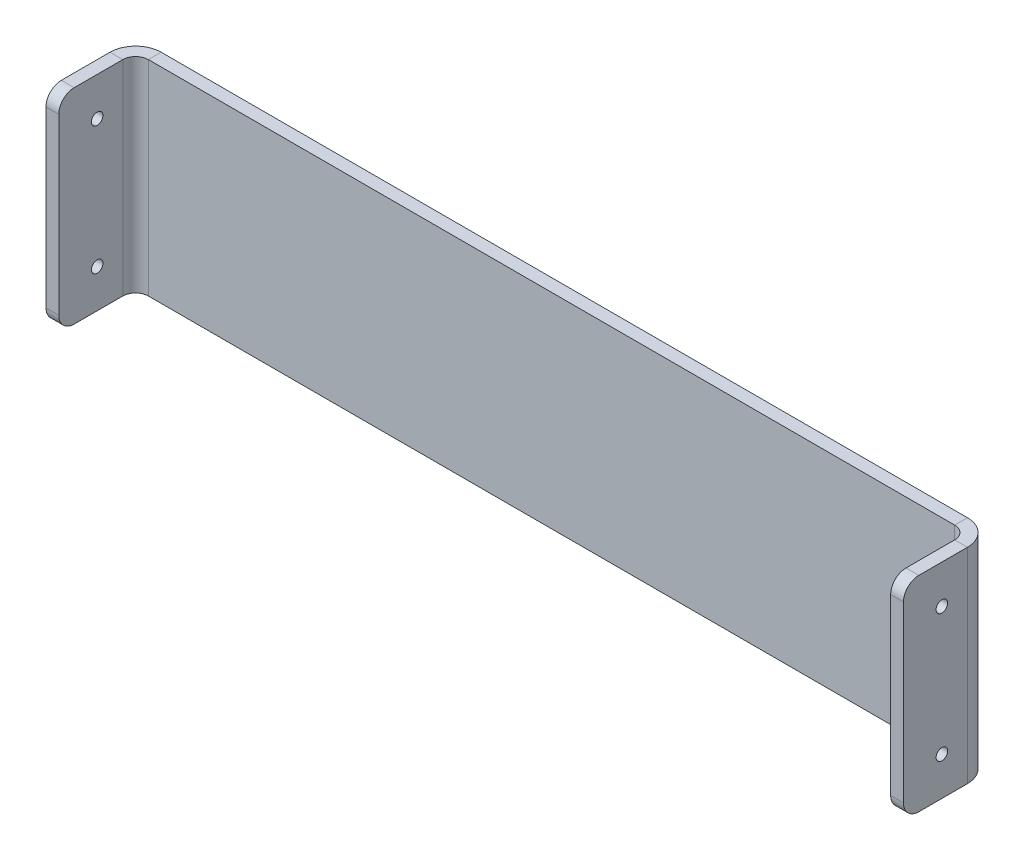
ISO-10303-21;
HEADER;
FILE_DESCRIPTION(('STEP AP214'),'2;1');
FILE_NAME('part.step','',(''),(''),'','','');
FILE_SCHEMA(('AUTOMOTIVE_DESIGN { 1 0 10303 214 1 1 1 1 }'));
ENDSEC;
DATA;
#1=APPLICATION_CONTEXT('core data for automotive mechanical design processes');
#2=APPLICATION_PROTOCOL_DEFINITION('international standard','automotive_design',2000,#1);
#3=PRODUCT_CONTEXT('',#1,'mechanical');
#4=PRODUCT('Part','Part','',(#3));
#5=PRODUCT_RELATED_PRODUCT_CATEGORY('part','',(#4));
#6=PRODUCT_DEFINITION_FORMATION('','',#4);
#7=PRODUCT_DEFINITION_CONTEXT('part definition',#1,'design');
#8=PRODUCT_DEFINITION('design','',#6,#7);
#9=PRODUCT_DEFINITION_SHAPE('','',#8);
#10=(LENGTH_UNIT() NAMED_UNIT(*) SI_UNIT(.MILLI.,.METRE.));
#11=(NAMED_UNIT(*) PLANE_ANGLE_UNIT() SI_UNIT($,.RADIAN.));
#12=(NAMED_UNIT(*) SI_UNIT($,.STERADIAN.) SOLID_ANGLE_UNIT());
#13=UNCERTAINTY_MEASURE_WITH_UNIT(LENGTH_MEASURE(1.E-05),#10,'distance_accuracy_value','');
#14=(GEOMETRIC_REPRESENTATION_CONTEXT(3) GLOBAL_UNCERTAINTY_ASSIGNED_CONTEXT((#13)) GLOBAL_UNIT_ASSIGNED_CONTEXT((#10,
#11,#12)) REPRESENTATION_CONTEXT('',''));
#15=CARTESIAN_POINT('',(0.,0.,0.));
#16=DIRECTION('',(0.,0.,1.));
#17=DIRECTION('',(1.,0.,0.));
#18=AXIS2_PLACEMENT_3D('',#15,#16,#17);
#19=CARTESIAN_POINT('',(0.,80.,5.));
#20=DIRECTION('',(0.,-1.,0.));
#21=DIRECTION('',(-1.,0.,0.));
#22=AXIS2_PLACEMENT_3D('',#19,#20,#21);
#23=PLANE('',#22);
#24=DIRECTION('',(0.,0.,1.));
#25=VECTOR('',#24,1.);
#26=CARTESIAN_POINT('',(325.,80.,5.));
#27=LINE('',#26,#25);
#28=CARTESIAN_POINT('',(325.,80.,0.));
#29=VERTEX_POINT('',#28);
#30=CARTESIAN_POINT('',(325.,80.,5.));
#31=VERTEX_POINT('',#30);
#32=EDGE_CURVE('E11',#29,#31,#27,.T.);
#33=ORIENTED_EDGE('',*,*,#32,.F.);
#34=DIRECTION('',(-1.,0.,0.));
#35=VECTOR('',#34,1.);
#36=CARTESIAN_POINT('',(0.,80.,0.));
#37=LINE('',#36,#35);
#38=CARTESIAN_POINT('',(10.,80.,0.));
#39=VERTEX_POINT('',#38);
#40=EDGE_CURVE('E110',#29,#39,#37,.T.);
#41=ORIENTED_EDGE('',*,*,#40,.T.);
#42=DIRECTION('',(0.,0.,1.));
#43=VECTOR('',#42,1.);
#44=CARTESIAN_POINT('',(10.,80.,5.));
#45=LINE('',#44,#43);
#46=CARTESIAN_POINT('',(10.,80.,5.));
#47=VERTEX_POINT('',#46);
#48=EDGE_CURVE('E51',#39,#47,#45,.T.);
#49=ORIENTED_EDGE('',*,*,#48,.T.);
#50=DIRECTION('',(-1.,0.,0.));
#51=VECTOR('',#50,1.);
#52=CARTESIAN_POINT('',(0.,80.,5.));
#53=LINE('',#52,#51);
#54=EDGE_CURVE('E112',#31,#47,#53,.T.);
#55=ORIENTED_EDGE('',*,*,#54,.F.);
#56=EDGE_LOOP('',(#33,#41,#49,#55));
#57=FACE_BOUND('',#56,.T.);
#58=ADVANCED_FACE('F41',(#57),#23,.F.);
#59=CARTESIAN_POINT('',(10.,80.,10.));
#60=DIRECTION('',(0.,-1.,0.));
#61=DIRECTION('',(0.,0.,-1.));
#62=AXIS2_PLACEMENT_3D('',#59,#60,#61);
#63=PLANE('',#62);
#64=ORIENTED_EDGE('',*,*,#48,.F.);
#65=CARTESIAN_POINT('',(10.,80.,10.));
#66=DIRECTION('',(0.,-1.,0.));
#67=DIRECTION('',(1.,0.,0.));
#68=AXIS2_PLACEMENT_3D('',#65,#66,#67);
#69=CIRCLE('',#68,10.);
#70=CARTESIAN_POINT('',(0.,80.,10.));
#71=VERTEX_POINT('',#70);
#72=EDGE_CURVE('E204',#39,#71,#69,.F.);
#73=ORIENTED_EDGE('',*,*,#72,.T.);
#74=DIRECTION('',(1.,0.,0.));
#75=VECTOR('',#74,1.);
#76=CARTESIAN_POINT('',(5.,80.,10.));
#77=LINE('',#76,#75);
#78=CARTESIAN_POINT('',(5.,80.,10.));
#79=VERTEX_POINT('',#78);
#80=EDGE_CURVE('E194',#71,#79,#77,.T.);
#81=ORIENTED_EDGE('',*,*,#80,.T.);
#82=CARTESIAN_POINT('',(10.,80.,10.));
#83=DIRECTION('',(0.,1.,0.));
#84=DIRECTION('',(0.,0.,1.));
#85=AXIS2_PLACEMENT_3D('',#82,#83,#84);
#86=CIRCLE('',#85,5.);
#87=EDGE_CURVE('E202',#47,#79,#86,.T.);
#88=ORIENTED_EDGE('',*,*,#87,.F.);
#89=EDGE_LOOP('',(#64,#73,#81,#88));
#90=FACE_BOUND('',#89,.T.);
#91=ADVANCED_FACE('F201',(#90),#63,.F.);
#92=CARTESIAN_POINT('',(5.,80.,35.));
#93=DIRECTION('',(0.,1.,0.));
#94=DIRECTION('',(0.,0.,-1.));
#95=AXIS2_PLACEMENT_3D('',#92,#93,#94);
#96=PLANE('',#95);
#97=ORIENTED_EDGE('',*,*,#80,.F.);
#98=DIRECTION('',(0.,0.,1.));
#99=VECTOR('',#98,1.);
#100=CARTESIAN_POINT('',(0.,80.,35.));
#101=LINE('',#100,#99);
#102=CARTESIAN_POINT('',(0.,80.,29.));
#103=VERTEX_POINT('',#102);
#104=EDGE_CURVE('E275',#103,#71,#101,.F.);
#105=ORIENTED_EDGE('',*,*,#104,.F.);
#106=DIRECTION('',(1.,0.,0.));
#107=VECTOR('',#106,1.);
#108=CARTESIAN_POINT('',(5.,80.,29.));
#109=LINE('',#108,#107);
#110=CARTESIAN_POINT('',(5.,80.,29.));
#111=VERTEX_POINT('',#110);
#112=EDGE_CURVE('E191',#103,#111,#109,.T.);
#113=ORIENTED_EDGE('',*,*,#112,.T.);
#114=DIRECTION('',(0.,0.,-1.));
#115=VECTOR('',#114,1.);
#116=CARTESIAN_POINT('',(5.,80.,35.));
#117=LINE('',#116,#115);
#118=EDGE_CURVE('E221',#111,#79,#117,.T.);
#119=ORIENTED_EDGE('',*,*,#118,.T.);
#120=EDGE_LOOP('',(#97,#105,#113,#119));
#121=FACE_BOUND('',#120,.T.);
#122=ADVANCED_FACE('F222',(#121),#96,.T.);
#123=CARTESIAN_POINT('',(5.,74.,29.));
#124=DIRECTION('',(-1.,0.,0.));
#125=DIRECTION('',(0.,-1.,0.));
#126=AXIS2_PLACEMENT_3D('',#123,#124,#125);
#127=CYLINDRICAL_SURFACE('',#126,6.);
#128=ORIENTED_EDGE('',*,*,#112,.F.);
#129=CARTESIAN_POINT('',(0.,74.,29.));
#130=DIRECTION('',(-1.,0.,0.));
#131=DIRECTION('',(0.,-1.,0.));
#132=AXIS2_PLACEMENT_3D('',#129,#130,#131);
#133=CIRCLE('',#132,6.);
#134=CARTESIAN_POINT('',(0.,74.,35.));
#135=VERTEX_POINT('',#134);
#136=EDGE_CURVE('E141',#103,#135,#133,.F.);
#137=ORIENTED_EDGE('',*,*,#136,.T.);
#138=DIRECTION('',(1.,0.,0.));
#139=VECTOR('',#138,1.);
#140=CARTESIAN_POINT('',(5.,74.,35.));
#141=LINE('',#140,#139);
#142=CARTESIAN_POINT('',(5.,74.,35.));
#143=VERTEX_POINT('',#142);
#144=EDGE_CURVE('E188',#135,#143,#141,.T.);
#145=ORIENTED_EDGE('',*,*,#144,.T.);
#146=CARTESIAN_POINT('',(5.,74.,29.));
#147=DIRECTION('',(-1.,0.,0.));
#148=DIRECTION('',(0.,-1.,0.));
#149=AXIS2_PLACEMENT_3D('',#146,#147,#148);
#150=CIRCLE('',#149,6.);
#151=EDGE_CURVE('E227',#111,#143,#150,.F.);
#152=ORIENTED_EDGE('',*,*,#151,.F.);
#153=EDGE_LOOP('',(#128,#137,#145,#152));
#154=FACE_BOUND('',#153,.T.);
#155=ADVANCED_FACE('F293',(#154),#127,.T.);
#156=CARTESIAN_POINT('',(5.,0.,35.));
#157=DIRECTION('',(0.,0.,1.));
#158=DIRECTION('',(0.,1.,0.));
#159=AXIS2_PLACEMENT_3D('',#156,#157,#158);
#160=PLANE('',#159);
#161=ORIENTED_EDGE('',*,*,#144,.F.);
#162=DIRECTION('',(0.,-1.,0.));
#163=VECTOR('',#162,1.);
#164=CARTESIAN_POINT('',(0.,0.,35.));
#165=LINE('',#164,#163);
#166=CARTESIAN_POINT('',(0.,6.,35.));
#167=VERTEX_POINT('',#166);
#168=EDGE_CURVE('E158',#167,#135,#165,.F.);
#169=ORIENTED_EDGE('',*,*,#168,.F.);
#170=DIRECTION('',(1.,0.,0.));
#171=VECTOR('',#170,1.);
#172=CARTESIAN_POINT('',(5.,6.,35.));
#173=LINE('',#172,#171);
#174=CARTESIAN_POINT('',(5.,6.,35.));
#175=VERTEX_POINT('',#174);
#176=EDGE_CURVE('E185',#167,#175,#173,.T.);
#177=ORIENTED_EDGE('',*,*,#176,.T.);
#178=DIRECTION('',(0.,1.,0.));
#179=VECTOR('',#178,1.);
#180=CARTESIAN_POINT('',(5.,0.,35.));
#181=LINE('',#180,#179);
#182=EDGE_CURVE('E341',#175,#143,#181,.T.);
#183=ORIENTED_EDGE('',*,*,#182,.T.);
#184=EDGE_LOOP('',(#161,#169,#177,#183));
#185=FACE_BOUND('',#184,.T.);
#186=ADVANCED_FACE('F377',(#185),#160,.T.);
#187=CARTESIAN_POINT('',(5.,6.,29.));
#188=DIRECTION('',(-1.,0.,0.));
#189=DIRECTION('',(0.,-1.,0.));
#190=AXIS2_PLACEMENT_3D('',#187,#188,#189);
#191=CYLINDRICAL_SURFACE('',#190,6.);
#192=ORIENTED_EDGE('',*,*,#176,.F.);
#193=CARTESIAN_POINT('',(0.,6.,29.));
#194=DIRECTION('',(-1.,0.,0.));
#195=DIRECTION('',(0.,-1.,0.));
#196=AXIS2_PLACEMENT_3D('',#193,#194,#195);
#197=CIRCLE('',#196,6.);
#198=CARTESIAN_POINT('',(0.,0.,29.));
#199=VERTEX_POINT('',#198);
#200=EDGE_CURVE('E276',#167,#199,#197,.F.);
#201=ORIENTED_EDGE('',*,*,#200,.T.);
#202=DIRECTION('',(1.,0.,0.));
#203=VECTOR('',#202,1.);
#204=CARTESIAN_POINT('',(5.,0.,29.));
#205=LINE('',#204,#203);
#206=CARTESIAN_POINT('',(5.,0.,29.));
#207=VERTEX_POINT('',#206);
#208=EDGE_CURVE('E182',#199,#207,#205,.T.);
#209=ORIENTED_EDGE('',*,*,#208,.T.);
#210=CARTESIAN_POINT('',(5.,6.,29.));
#211=DIRECTION('',(-1.,0.,0.));
#212=DIRECTION('',(0.,-1.,0.));
#213=AXIS2_PLACEMENT_3D('',#210,#211,#212);
#214=CIRCLE('',#213,6.);
#215=EDGE_CURVE('E345',#175,#207,#214,.F.);
#216=ORIENTED_EDGE('',*,*,#215,.F.);
#217=EDGE_LOOP('',(#192,#201,#209,#216));
#218=FACE_BOUND('',#217,.T.);
#219=ADVANCED_FACE('F378',(#218),#191,.T.);
#220=CARTESIAN_POINT('',(5.,0.,35.));
#221=DIRECTION('',(0.,1.,0.));
#222=DIRECTION('',(0.,0.,-1.));
#223=AXIS2_PLACEMENT_3D('',#220,#221,#222);
#224=PLANE('',#223);
#225=ORIENTED_EDGE('',*,*,#208,.F.);
#226=DIRECTION('',(0.,0.,1.));
#227=VECTOR('',#226,1.);
#228=CARTESIAN_POINT('',(0.,0.,35.));
#229=LINE('',#228,#227);
#230=CARTESIAN_POINT('',(0.,0.,10.));
#231=VERTEX_POINT('',#230);
#232=EDGE_CURVE('E272',#199,#231,#229,.F.);
#233=ORIENTED_EDGE('',*,*,#232,.T.);
#234=DIRECTION('',(1.,0.,0.));
#235=VECTOR('',#234,1.);
#236=CARTESIAN_POINT('',(5.,0.,10.));
#237=LINE('',#236,#235);
#238=CARTESIAN_POINT('',(5.,0.,10.));
#239=VERTEX_POINT('',#238);
#240=EDGE_CURVE('E179',#231,#239,#237,.T.);
#241=ORIENTED_EDGE('',*,*,#240,.T.);
#242=DIRECTION('',(0.,0.,-1.));
#243=VECTOR('',#242,1.);
#244=CARTESIAN_POINT('',(5.,0.,35.));
#245=LINE('',#244,#243);
#246=EDGE_CURVE('E228',#207,#239,#245,.T.);
#247=ORIENTED_EDGE('',*,*,#246,.F.);
#248=EDGE_LOOP('',(#225,#233,#241,#247));
#249=FACE_BOUND('',#248,.T.);
#250=ADVANCED_FACE('F350',(#249),#224,.F.);
#251=CARTESIAN_POINT('',(10.,0.,10.));
#252=DIRECTION('',(0.,-1.,0.));
#253=DIRECTION('',(0.,0.,-1.));
#254=AXIS2_PLACEMENT_3D('',#251,#252,#253);
#255=PLANE('',#254);
#256=ORIENTED_EDGE('',*,*,#240,.F.);
#257=CARTESIAN_POINT('',(10.,0.,10.));
#258=DIRECTION('',(0.,-1.,0.));
#259=DIRECTION('',(1.,0.,0.));
#260=AXIS2_PLACEMENT_3D('',#257,#258,#259);
#261=CIRCLE('',#260,10.);
#262=CARTESIAN_POINT('',(10.,0.,0.));
#263=VERTEX_POINT('',#262);
#264=EDGE_CURVE('E152',#231,#263,#261,.T.);
#265=ORIENTED_EDGE('',*,*,#264,.T.);
#266=DIRECTION('',(0.,0.,1.));
#267=VECTOR('',#266,1.);
#268=CARTESIAN_POINT('',(10.,0.,5.));
#269=LINE('',#268,#267);
#270=CARTESIAN_POINT('',(10.,0.,5.));
#271=VERTEX_POINT('',#270);
#272=EDGE_CURVE('E177',#263,#271,#269,.T.);
#273=ORIENTED_EDGE('',*,*,#272,.T.);
#274=CARTESIAN_POINT('',(10.,0.,10.));
#275=DIRECTION('',(0.,1.,0.));
#276=DIRECTION('',(0.,0.,1.));
#277=AXIS2_PLACEMENT_3D('',#274,#275,#276);
#278=CIRCLE('',#277,5.);
#279=EDGE_CURVE('E218',#239,#271,#278,.F.);
#280=ORIENTED_EDGE('',*,*,#279,.F.);
#281=EDGE_LOOP('',(#256,#265,#273,#280));
#282=FACE_BOUND('',#281,.T.);
#283=ADVANCED_FACE('F354',(#282),#255,.T.);
#284=CARTESIAN_POINT('',(0.,0.,5.));
#285=DIRECTION('',(0.,1.,0.));
#286=DIRECTION('',(1.,0.,0.));
#287=AXIS2_PLACEMENT_3D('',#284,#285,#286);
#288=PLANE('',#287);
#289=ORIENTED_EDGE('',*,*,#272,.F.);
#290=DIRECTION('',(-1.,0.,0.));
#291=VECTOR('',#290,1.);
#292=CARTESIAN_POINT('',(0.,0.,0.));
#293=LINE('',#292,#291);
#294=CARTESIAN_POINT('',(325.,0.,0.));
#295=VERTEX_POINT('',#294);
#296=EDGE_CURVE('E140',#263,#295,#293,.F.);
#297=ORIENTED_EDGE('',*,*,#296,.T.);
#298=DIRECTION('',(0.,0.,1.));
#299=VECTOR('',#298,1.);
#300=CARTESIAN_POINT('',(325.,0.,5.));
#301=LINE('',#300,#299);
#302=CARTESIAN_POINT('',(325.,0.,5.));
#303=VERTEX_POINT('',#302);
#304=EDGE_CURVE('E174',#295,#303,#301,.T.);
#305=ORIENTED_EDGE('',*,*,#304,.T.);
#306=DIRECTION('',(1.,0.,0.));
#307=VECTOR('',#306,1.);
#308=CARTESIAN_POINT('',(0.,0.,5.));
#309=LINE('',#308,#307);
#310=EDGE_CURVE('E300',#271,#303,#309,.T.);
#311=ORIENTED_EDGE('',*,*,#310,.F.);
#312=EDGE_LOOP('',(#289,#297,#305,#311));
#313=FACE_BOUND('',#312,.T.);
#314=ADVANCED_FACE('F357',(#313),#288,.F.);
#315=CARTESIAN_POINT('',(325.,0.,10.));
#316=DIRECTION('',(0.,1.,0.));
#317=DIRECTION('',(0.,0.,1.));
#318=AXIS2_PLACEMENT_3D('',#315,#316,#317);
#319=PLANE('',#318);
#320=ORIENTED_EDGE('',*,*,#304,.F.);
#321=CARTESIAN_POINT('',(325.,0.,10.));
#322=DIRECTION('',(0.,1.,0.));
#323=DIRECTION('',(0.,0.,1.));
#324=AXIS2_PLACEMENT_3D('',#321,#322,#323);
#325=CIRCLE('',#324,10.);
#326=CARTESIAN_POINT('',(335.,0.,10.));
#327=VERTEX_POINT('',#326);
#328=EDGE_CURVE('E128',#295,#327,#325,.F.);
#329=ORIENTED_EDGE('',*,*,#328,.T.);
#330=DIRECTION('',(-1.,0.,0.));
#331=VECTOR('',#330,1.);
#332=CARTESIAN_POINT('',(330.,0.,10.));
#333=LINE('',#332,#331);
#334=CARTESIAN_POINT('',(330.,0.,10.));
#335=VERTEX_POINT('',#334);
#336=EDGE_CURVE('E171',#327,#335,#333,.T.);
#337=ORIENTED_EDGE('',*,*,#336,.T.);
#338=CARTESIAN_POINT('',(325.,0.,10.));
#339=DIRECTION('',(0.,-1.,0.));
#340=DIRECTION('',(0.,0.,-1.));
#341=AXIS2_PLACEMENT_3D('',#338,#339,#340);
#342=CIRCLE('',#341,5.);
#343=EDGE_CURVE('E245',#303,#335,#342,.T.);
#344=ORIENTED_EDGE('',*,*,#343,.F.);
#345=EDGE_LOOP('',(#320,#329,#337,#344));
#346=FACE_BOUND('',#345,.T.);
#347=ADVANCED_FACE('F452',(#346),#319,.F.);
#348=CARTESIAN_POINT('',(330.,0.,35.));
#349=DIRECTION('',(0.,-1.,0.));
#350=DIRECTION('',(0.,0.,-1.));
#351=AXIS2_PLACEMENT_3D('',#348,#349,#350);
#352=PLANE('',#351);
#353=ORIENTED_EDGE('',*,*,#336,.F.);
#354=DIRECTION('',(0.,0.,-1.));
#355=VECTOR('',#354,1.);
#356=CARTESIAN_POINT('',(335.,0.,35.));
#357=LINE('',#356,#355);
#358=CARTESIAN_POINT('',(335.,0.,29.));
#359=VERTEX_POINT('',#358);
#360=EDGE_CURVE('E259',#359,#327,#357,.T.);
#361=ORIENTED_EDGE('',*,*,#360,.F.);
#362=DIRECTION('',(-1.,0.,0.));
#363=VECTOR('',#362,1.);
#364=CARTESIAN_POINT('',(330.,0.,29.));
#365=LINE('',#364,#363);
#366=CARTESIAN_POINT('',(330.,0.,29.));
#367=VERTEX_POINT('',#366);
#368=EDGE_CURVE('E168',#359,#367,#365,.T.);
#369=ORIENTED_EDGE('',*,*,#368,.T.);
#370=DIRECTION('',(0.,0.,-1.));
#371=VECTOR('',#370,1.);
#372=CARTESIAN_POINT('',(330.,0.,35.));
#373=LINE('',#372,#371);
#374=EDGE_CURVE('E321',#367,#335,#373,.T.);
#375=ORIENTED_EDGE('',*,*,#374,.T.);
#376=EDGE_LOOP('',(#353,#361,#369,#375));
#377=FACE_BOUND('',#376,.T.);
#378=ADVANCED_FACE('F448',(#377),#352,.T.);
#379=CARTESIAN_POINT('',(330.,6.,29.));
#380=DIRECTION('',(1.,0.,0.));
#381=DIRECTION('',(0.,0.,-1.));
#382=AXIS2_PLACEMENT_3D('',#379,#380,#381);
#383=CYLINDRICAL_SURFACE('',#382,6.);
#384=ORIENTED_EDGE('',*,*,#368,.F.);
#385=CARTESIAN_POINT('',(335.,6.,29.));
#386=DIRECTION('',(1.,0.,0.));
#387=DIRECTION('',(0.,0.,-1.));
#388=AXIS2_PLACEMENT_3D('',#385,#386,#387);
#389=CIRCLE('',#388,6.);
#390=CARTESIAN_POINT('',(335.,6.,35.));
#391=VERTEX_POINT('',#390);
#392=EDGE_CURVE('E246',#359,#391,#389,.F.);
#393=ORIENTED_EDGE('',*,*,#392,.T.);
#394=DIRECTION('',(-1.,0.,0.));
#395=VECTOR('',#394,1.);
#396=CARTESIAN_POINT('',(330.,6.,35.));
#397=LINE('',#396,#395);
#398=CARTESIAN_POINT('',(330.,6.,35.));
#399=VERTEX_POINT('',#398);
#400=EDGE_CURVE('E165',#391,#399,#397,.T.);
#401=ORIENTED_EDGE('',*,*,#400,.T.);
#402=CARTESIAN_POINT('',(330.,6.,29.));
#403=DIRECTION('',(1.,0.,0.));
#404=DIRECTION('',(0.,0.,-1.));
#405=AXIS2_PLACEMENT_3D('',#402,#403,#404);
#406=CIRCLE('',#405,6.);
#407=EDGE_CURVE('E324',#367,#399,#406,.F.);
#408=ORIENTED_EDGE('',*,*,#407,.F.);
#409=EDGE_LOOP('',(#384,#393,#401,#408));
#410=FACE_BOUND('',#409,.T.);
#411=ADVANCED_FACE('F444',(#410),#383,.T.);
#412=CARTESIAN_POINT('',(330.,0.,35.));
#413=DIRECTION('',(0.,0.,1.));
#414=DIRECTION('',(0.,-1.,0.));
#415=AXIS2_PLACEMENT_3D('',#412,#413,#414);
#416=PLANE('',#415);
#417=ORIENTED_EDGE('',*,*,#400,.F.);
#418=DIRECTION('',(0.,1.,0.));
#419=VECTOR('',#418,1.);
#420=CARTESIAN_POINT('',(335.,0.,35.));
#421=LINE('',#420,#419);
#422=CARTESIAN_POINT('',(335.,74.,35.));
#423=VERTEX_POINT('',#422);
#424=EDGE_CURVE('E256',#423,#391,#421,.F.);
#425=ORIENTED_EDGE('',*,*,#424,.F.);
#426=DIRECTION('',(-1.,0.,0.));
#427=VECTOR('',#426,1.);
#428=CARTESIAN_POINT('',(330.,74.,35.));
#429=LINE('',#428,#427);
#430=CARTESIAN_POINT('',(330.,74.,35.));
#431=VERTEX_POINT('',#430);
#432=EDGE_CURVE('E162',#423,#431,#429,.T.);
#433=ORIENTED_EDGE('',*,*,#432,.T.);
#434=DIRECTION('',(0.,-1.,0.));
#435=VECTOR('',#434,1.);
#436=CARTESIAN_POINT('',(330.,0.,35.));
#437=LINE('',#436,#435);
#438=EDGE_CURVE('E312',#431,#399,#437,.T.);
#439=ORIENTED_EDGE('',*,*,#438,.T.);
#440=EDGE_LOOP('',(#417,#425,#433,#439));
#441=FACE_BOUND('',#440,.T.);
#442=ADVANCED_FACE('F440',(#441),#416,.T.);
#443=CARTESIAN_POINT('',(330.,74.,29.));
#444=DIRECTION('',(1.,0.,0.));
#445=DIRECTION('',(0.,0.,-1.));
#446=AXIS2_PLACEMENT_3D('',#443,#444,#445);
#447=CYLINDRICAL_SURFACE('',#446,6.);
#448=ORIENTED_EDGE('',*,*,#432,.F.);
#449=CARTESIAN_POINT('',(335.,74.,29.));
#450=DIRECTION('',(1.,0.,0.));
#451=DIRECTION('',(0.,0.,-1.));
#452=AXIS2_PLACEMENT_3D('',#449,#450,#451);
#453=CIRCLE('',#452,6.);
#454=CARTESIAN_POINT('',(335.,80.,29.));
#455=VERTEX_POINT('',#454);
#456=EDGE_CURVE('E260',#423,#455,#453,.F.);
#457=ORIENTED_EDGE('',*,*,#456,.T.);
#458=DIRECTION('',(-1.,0.,0.));
#459=VECTOR('',#458,1.);
#460=CARTESIAN_POINT('',(330.,80.,29.));
#461=LINE('',#460,#459);
#462=CARTESIAN_POINT('',(330.,80.,29.));
#463=VERTEX_POINT('',#462);
#464=EDGE_CURVE('E159',#455,#463,#461,.T.);
#465=ORIENTED_EDGE('',*,*,#464,.T.);
#466=CARTESIAN_POINT('',(330.,74.,29.));
#467=DIRECTION('',(1.,0.,0.));
#468=DIRECTION('',(0.,0.,-1.));
#469=AXIS2_PLACEMENT_3D('',#466,#467,#468);
#470=CIRCLE('',#469,6.);
#471=EDGE_CURVE('E315',#431,#463,#470,.F.);
#472=ORIENTED_EDGE('',*,*,#471,.F.);
#473=EDGE_LOOP('',(#448,#457,#465,#472));
#474=FACE_BOUND('',#473,.T.);
#475=ADVANCED_FACE('F408',(#474),#447,.T.);
#476=CARTESIAN_POINT('',(330.,80.,35.));
#477=DIRECTION('',(0.,-1.,0.));
#478=DIRECTION('',(0.,0.,-1.));
#479=AXIS2_PLACEMENT_3D('',#476,#477,#478);
#480=PLANE('',#479);
#481=ORIENTED_EDGE('',*,*,#464,.F.);
#482=DIRECTION('',(0.,0.,-1.));
#483=VECTOR('',#482,1.);
#484=CARTESIAN_POINT('',(335.,80.,35.));
#485=LINE('',#484,#483);
#486=CARTESIAN_POINT('',(335.,80.,10.));
#487=VERTEX_POINT('',#486);
#488=EDGE_CURVE('E257',#455,#487,#485,.T.);
#489=ORIENTED_EDGE('',*,*,#488,.T.);
#490=DIRECTION('',(-1.,0.,0.));
#491=VECTOR('',#490,1.);
#492=CARTESIAN_POINT('',(330.,80.,10.));
#493=LINE('',#492,#491);
#494=CARTESIAN_POINT('',(330.,80.,10.));
#495=VERTEX_POINT('',#494);
#496=EDGE_CURVE('E45',#487,#495,#493,.T.);
#497=ORIENTED_EDGE('',*,*,#496,.T.);
#498=DIRECTION('',(0.,0.,-1.));
#499=VECTOR('',#498,1.);
#500=CARTESIAN_POINT('',(330.,80.,35.));
#501=LINE('',#500,#499);
#502=EDGE_CURVE('E318',#463,#495,#501,.T.);
#503=ORIENTED_EDGE('',*,*,#502,.F.);
#504=EDGE_LOOP('',(#481,#489,#497,#503));
#505=FACE_BOUND('',#504,.T.);
#506=ADVANCED_FACE('F400',(#505),#480,.F.);
#507=CARTESIAN_POINT('',(5.,15.,20.));
#508=DIRECTION('',(-1.,0.,0.));
#509=DIRECTION('',(0.,-1.,0.));
#510=AXIS2_PLACEMENT_3D('',#507,#508,#509);
#511=CYLINDRICAL_SURFACE('',#510,2.25);
#512=CARTESIAN_POINT('',(5.,15.,20.));
#513=DIRECTION('',(-1.,0.,0.));
#514=DIRECTION('',(0.,-1.,0.));
#515=AXIS2_PLACEMENT_3D('',#512,#513,#514);
#516=CIRCLE('',#515,2.25);
#517=CARTESIAN_POINT('',(5.,12.75,20.));
#518=VERTEX_POINT('',#517);
#519=EDGE_CURVE('E334',#518,#518,#516,.T.);
#520=ORIENTED_EDGE('',*,*,#519,.F.);
#521=EDGE_LOOP('',(#520));
#522=FACE_BOUND('',#521,.T.);
#523=CARTESIAN_POINT('',(0.,15.,20.));
#524=DIRECTION('',(-1.,0.,0.));
#525=DIRECTION('',(0.,-1.,0.));
#526=AXIS2_PLACEMENT_3D('',#523,#524,#525);
#527=CIRCLE('',#526,2.25);
#528=CARTESIAN_POINT('',(0.,12.75,20.));
#529=VERTEX_POINT('',#528);
#530=EDGE_CURVE('E147',#529,#529,#527,.T.);
#531=ORIENTED_EDGE('',*,*,#530,.T.);
#532=EDGE_LOOP('',(#531));
#533=FACE_BOUND('',#532,.T.);
#534=ADVANCED_FACE('F398',(#522,#533),#511,.F.);
#535=CARTESIAN_POINT('',(5.,65.,20.));
#536=DIRECTION('',(-1.,0.,0.));
#537=DIRECTION('',(0.,-1.,0.));
#538=AXIS2_PLACEMENT_3D('',#535,#536,#537);
#539=CYLINDRICAL_SURFACE('',#538,2.25);
#540=CARTESIAN_POINT('',(5.,65.,20.));
#541=DIRECTION('',(-1.,0.,0.));
#542=DIRECTION('',(0.,-1.,0.));
#543=AXIS2_PLACEMENT_3D('',#540,#541,#542);
#544=CIRCLE('',#543,2.25);
#545=CARTESIAN_POINT('',(5.,62.75,20.));
#546=VERTEX_POINT('',#545);
#547=EDGE_CURVE('E336',#546,#546,#544,.T.);
#548=ORIENTED_EDGE('',*,*,#547,.F.);
#549=EDGE_LOOP('',(#548));
#550=FACE_BOUND('',#549,.T.);
#551=CARTESIAN_POINT('',(0.,65.,20.));
#552=DIRECTION('',(-1.,0.,0.));
#553=DIRECTION('',(0.,-1.,0.));
#554=AXIS2_PLACEMENT_3D('',#551,#552,#553);
#555=CIRCLE('',#554,2.25);
#556=CARTESIAN_POINT('',(0.,62.75,20.));
#557=VERTEX_POINT('',#556);
#558=EDGE_CURVE('E150',#557,#557,#555,.T.);
#559=ORIENTED_EDGE('',*,*,#558,.T.);
#560=EDGE_LOOP('',(#559));
#561=FACE_BOUND('',#560,.T.);
#562=ADVANCED_FACE('F43',(#550,#561),#539,.F.);
#563=CARTESIAN_POINT('',(330.,15.,20.));
#564=DIRECTION('',(1.,0.,0.));
#565=DIRECTION('',(0.,0.,-1.));
#566=AXIS2_PLACEMENT_3D('',#563,#564,#565);
#567=CYLINDRICAL_SURFACE('',#566,2.25);
#568=CARTESIAN_POINT('',(330.,15.,20.));
#569=DIRECTION('',(1.,0.,0.));
#570=DIRECTION('',(0.,0.,-1.));
#571=AXIS2_PLACEMENT_3D('',#568,#569,#570);
#572=CIRCLE('',#571,2.25);
#573=CARTESIAN_POINT('',(330.,15.,17.75));
#574=VERTEX_POINT('',#573);
#575=EDGE_CURVE('E306',#574,#574,#572,.T.);
#576=ORIENTED_EDGE('',*,*,#575,.F.);
#577=EDGE_LOOP('',(#576));
#578=FACE_BOUND('',#577,.T.);
#579=CARTESIAN_POINT('',(335.,15.,20.));
#580=DIRECTION('',(1.,0.,0.));
#581=DIRECTION('',(0.,0.,-1.));
#582=AXIS2_PLACEMENT_3D('',#579,#580,#581);
#583=CIRCLE('',#582,2.25);
#584=CARTESIAN_POINT('',(335.,15.,17.75));
#585=VERTEX_POINT('',#584);
#586=EDGE_CURVE('E250',#585,#585,#583,.T.);
#587=ORIENTED_EDGE('',*,*,#586,.T.);
#588=EDGE_LOOP('',(#587));
#589=FACE_BOUND('',#588,.T.);
#590=ADVANCED_FACE('F406',(#578,#589),#567,.F.);
#591=CARTESIAN_POINT('',(330.,65.,20.));
#592=DIRECTION('',(1.,0.,0.));
#593=DIRECTION('',(0.,0.,-1.));
#594=AXIS2_PLACEMENT_3D('',#591,#592,#593);
#595=CYLINDRICAL_SURFACE('',#594,2.25);
#596=CARTESIAN_POINT('',(330.,65.,20.));
#597=DIRECTION('',(1.,0.,0.));
#598=DIRECTION('',(0.,0.,-1.));
#599=AXIS2_PLACEMENT_3D('',#596,#597,#598);
#600=CIRCLE('',#599,2.25);
#601=CARTESIAN_POINT('',(330.,65.,17.75));
#602=VERTEX_POINT('',#601);
#603=EDGE_CURVE('E309',#602,#602,#600,.T.);
#604=ORIENTED_EDGE('',*,*,#603,.F.);
#605=EDGE_LOOP('',(#604));
#606=FACE_BOUND('',#605,.T.);
#607=CARTESIAN_POINT('',(335.,65.,20.));
#608=DIRECTION('',(1.,0.,0.));
#609=DIRECTION('',(0.,0.,-1.));
#610=AXIS2_PLACEMENT_3D('',#607,#608,#609);
#611=CIRCLE('',#610,2.25);
#612=CARTESIAN_POINT('',(335.,65.,17.75));
#613=VERTEX_POINT('',#612);
#614=EDGE_CURVE('E253',#613,#613,#611,.T.);
#615=ORIENTED_EDGE('',*,*,#614,.T.);
#616=EDGE_LOOP('',(#615));
#617=FACE_BOUND('',#616,.T.);
#618=ADVANCED_FACE('F397',(#606,#617),#595,.F.);
#619=CARTESIAN_POINT('',(325.,80.,10.));
#620=DIRECTION('',(0.,1.,0.));
#621=DIRECTION('',(0.,0.,1.));
#622=AXIS2_PLACEMENT_3D('',#619,#620,#621);
#623=PLANE('',#622);
#624=CARTESIAN_POINT('',(325.,80.,10.));
#625=DIRECTION('',(0.,1.,0.));
#626=DIRECTION('',(0.,0.,1.));
#627=AXIS2_PLACEMENT_3D('',#624,#625,#626);
#628=CIRCLE('',#627,10.);
#629=EDGE_CURVE('E125',#487,#29,#628,.T.);
#630=ORIENTED_EDGE('',*,*,#629,.T.);
#631=ORIENTED_EDGE('',*,*,#32,.T.);
#632=CARTESIAN_POINT('',(325.,80.,10.));
#633=DIRECTION('',(0.,-1.,0.));
#634=DIRECTION('',(0.,0.,-1.));
#635=AXIS2_PLACEMENT_3D('',#632,#633,#634);
#636=CIRCLE('',#635,5.);
#637=EDGE_CURVE('E241',#495,#31,#636,.F.);
#638=ORIENTED_EDGE('',*,*,#637,.F.);
#639=ORIENTED_EDGE('',*,*,#496,.F.);
#640=EDGE_LOOP('',(#630,#631,#638,#639));
#641=FACE_BOUND('',#640,.T.);
#642=ADVANCED_FACE('F144',(#641),#623,.T.);
#643=CARTESIAN_POINT('',(330.,0.,35.));
#644=DIRECTION('',(1.,0.,0.));
#645=DIRECTION('',(0.,0.,-1.));
#646=AXIS2_PLACEMENT_3D('',#643,#644,#645);
#647=PLANE('',#646);
#648=ORIENTED_EDGE('',*,*,#575,.T.);
#649=EDGE_LOOP('',(#648));
#650=FACE_BOUND('',#649,.T.);
#651=ORIENTED_EDGE('',*,*,#603,.T.);
#652=EDGE_LOOP('',(#651));
#653=FACE_BOUND('',#652,.T.);
#654=ORIENTED_EDGE('',*,*,#502,.T.);
#655=DIRECTION('',(0.,-1.,0.));
#656=VECTOR('',#655,1.);
#657=CARTESIAN_POINT('',(330.,0.,10.));
#658=LINE('',#657,#656);
#659=EDGE_CURVE('E238',#495,#335,#658,.T.);
#660=ORIENTED_EDGE('',*,*,#659,.T.);
#661=ORIENTED_EDGE('',*,*,#374,.F.);
#662=ORIENTED_EDGE('',*,*,#407,.T.);
#663=ORIENTED_EDGE('',*,*,#438,.F.);
#664=ORIENTED_EDGE('',*,*,#471,.T.);
#665=EDGE_LOOP('',(#654,#660,#661,#662,#663,#664));
#666=FACE_BOUND('',#665,.T.);
#667=ADVANCED_FACE('F396',(#650,#653,#666),#647,.F.);
#668=CARTESIAN_POINT('',(0.,0.,5.));
#669=DIRECTION('',(0.,0.,-1.));
#670=DIRECTION('',(-1.,0.,0.));
#671=AXIS2_PLACEMENT_3D('',#668,#669,#670);
#672=PLANE('',#671);
#673=ORIENTED_EDGE('',*,*,#54,.T.);
#674=DIRECTION('',(0.,1.,0.));
#675=VECTOR('',#674,1.);
#676=CARTESIAN_POINT('',(10.,0.,5.));
#677=LINE('',#676,#675);
#678=EDGE_CURVE('E217',#47,#271,#677,.F.);
#679=ORIENTED_EDGE('',*,*,#678,.T.);
#680=ORIENTED_EDGE('',*,*,#310,.T.);
#681=DIRECTION('',(0.,-1.,0.));
#682=VECTOR('',#681,1.);
#683=CARTESIAN_POINT('',(325.,80.,5.));
#684=LINE('',#683,#682);
#685=EDGE_CURVE('E235',#303,#31,#684,.F.);
#686=ORIENTED_EDGE('',*,*,#685,.T.);
#687=EDGE_LOOP('',(#673,#679,#680,#686));
#688=FACE_BOUND('',#687,.T.);
#689=ADVANCED_FACE('F359',(#688),#672,.F.);
#690=CARTESIAN_POINT('',(5.,0.,35.));
#691=DIRECTION('',(-1.,0.,0.));
#692=DIRECTION('',(0.,-1.,0.));
#693=AXIS2_PLACEMENT_3D('',#690,#691,#692);
#694=PLANE('',#693);
#695=ORIENTED_EDGE('',*,*,#519,.T.);
#696=EDGE_LOOP('',(#695));
#697=FACE_BOUND('',#696,.T.);
#698=ORIENTED_EDGE('',*,*,#547,.T.);
#699=EDGE_LOOP('',(#698));
#700=FACE_BOUND('',#699,.T.);
#701=ORIENTED_EDGE('',*,*,#246,.T.);
#702=DIRECTION('',(0.,1.,0.));
#703=VECTOR('',#702,1.);
#704=CARTESIAN_POINT('',(5.,80.,10.));
#705=LINE('',#704,#703);
#706=EDGE_CURVE('E215',#239,#79,#705,.T.);
#707=ORIENTED_EDGE('',*,*,#706,.T.);
#708=ORIENTED_EDGE('',*,*,#118,.F.);
#709=ORIENTED_EDGE('',*,*,#151,.T.);
#710=ORIENTED_EDGE('',*,*,#182,.F.);
#711=ORIENTED_EDGE('',*,*,#215,.T.);
#712=EDGE_LOOP('',(#701,#707,#708,#709,#710,#711));
#713=FACE_BOUND('',#712,.T.);
#714=ADVANCED_FACE('F231',(#697,#700,#713),#694,.F.);
#715=CARTESIAN_POINT('',(325.,0.,10.));
#716=DIRECTION('',(0.,1.,0.));
#717=DIRECTION('',(0.,0.,1.));
#718=AXIS2_PLACEMENT_3D('',#715,#716,#717);
#719=CYLINDRICAL_SURFACE('',#718,5.);
#720=ORIENTED_EDGE('',*,*,#637,.T.);
#721=ORIENTED_EDGE('',*,*,#685,.F.);
#722=ORIENTED_EDGE('',*,*,#343,.T.);
#723=ORIENTED_EDGE('',*,*,#659,.F.);
#724=EDGE_LOOP('',(#720,#721,#722,#723));
#725=FACE_BOUND('',#724,.T.);
#726=ADVANCED_FACE('F361',(#725),#719,.F.);
#727=CARTESIAN_POINT('',(10.,0.,10.));
#728=DIRECTION('',(0.,-1.,0.));
#729=DIRECTION('',(1.,0.,0.));
#730=AXIS2_PLACEMENT_3D('',#727,#728,#729);
#731=CYLINDRICAL_SURFACE('',#730,5.);
#732=ORIENTED_EDGE('',*,*,#279,.T.);
#733=ORIENTED_EDGE('',*,*,#678,.F.);
#734=ORIENTED_EDGE('',*,*,#87,.T.);
#735=ORIENTED_EDGE('',*,*,#706,.F.);
#736=EDGE_LOOP('',(#732,#733,#734,#735));
#737=FACE_BOUND('',#736,.T.);
#738=ADVANCED_FACE('F213',(#737),#731,.F.);
#739=CARTESIAN_POINT('',(335.,0.,35.));
#740=DIRECTION('',(1.,0.,0.));
#741=DIRECTION('',(0.,0.,-1.));
#742=AXIS2_PLACEMENT_3D('',#739,#740,#741);
#743=PLANE('',#742);
#744=ORIENTED_EDGE('',*,*,#586,.F.);
#745=EDGE_LOOP('',(#744));
#746=FACE_BOUND('',#745,.T.);
#747=ORIENTED_EDGE('',*,*,#614,.F.);
#748=EDGE_LOOP('',(#747));
#749=FACE_BOUND('',#748,.T.);
#750=ORIENTED_EDGE('',*,*,#488,.F.);
#751=ORIENTED_EDGE('',*,*,#456,.F.);
#752=ORIENTED_EDGE('',*,*,#424,.T.);
#753=ORIENTED_EDGE('',*,*,#392,.F.);
#754=ORIENTED_EDGE('',*,*,#360,.T.);
#755=DIRECTION('',(0.,1.,0.));
#756=VECTOR('',#755,1.);
#757=CARTESIAN_POINT('',(335.,0.,10.));
#758=LINE('',#757,#756);
#759=EDGE_CURVE('E133',#487,#327,#758,.F.);
#760=ORIENTED_EDGE('',*,*,#759,.F.);
#761=EDGE_LOOP('',(#750,#751,#752,#753,#754,#760));
#762=FACE_BOUND('',#761,.T.);
#763=ADVANCED_FACE('F425',(#746,#749,#762),#743,.T.);
#764=CARTESIAN_POINT('',(0.,0.,0.));
#765=DIRECTION('',(0.,0.,-1.));
#766=DIRECTION('',(-1.,0.,0.));
#767=AXIS2_PLACEMENT_3D('',#764,#765,#766);
#768=PLANE('',#767);
#769=ORIENTED_EDGE('',*,*,#40,.F.);
#770=DIRECTION('',(0.,1.,0.));
#771=VECTOR('',#770,1.);
#772=CARTESIAN_POINT('',(325.,0.,0.));
#773=LINE('',#772,#771);
#774=EDGE_CURVE('E122',#295,#29,#773,.T.);
#775=ORIENTED_EDGE('',*,*,#774,.F.);
#776=ORIENTED_EDGE('',*,*,#296,.F.);
#777=DIRECTION('',(0.,1.,0.));
#778=VECTOR('',#777,1.);
#779=CARTESIAN_POINT('',(10.,0.,0.));
#780=LINE('',#779,#778);
#781=EDGE_CURVE('E138',#39,#263,#780,.F.);
#782=ORIENTED_EDGE('',*,*,#781,.F.);
#783=EDGE_LOOP('',(#769,#775,#776,#782));
#784=FACE_BOUND('',#783,.T.);
#785=ADVANCED_FACE('F136',(#784),#768,.T.);
#786=CARTESIAN_POINT('',(0.,0.,35.));
#787=DIRECTION('',(-1.,0.,0.));
#788=DIRECTION('',(0.,-1.,0.));
#789=AXIS2_PLACEMENT_3D('',#786,#787,#788);
#790=PLANE('',#789);
#791=ORIENTED_EDGE('',*,*,#530,.F.);
#792=EDGE_LOOP('',(#791));
#793=FACE_BOUND('',#792,.T.);
#794=ORIENTED_EDGE('',*,*,#558,.F.);
#795=EDGE_LOOP('',(#794));
#796=FACE_BOUND('',#795,.T.);
#797=ORIENTED_EDGE('',*,*,#232,.F.);
#798=ORIENTED_EDGE('',*,*,#200,.F.);
#799=ORIENTED_EDGE('',*,*,#168,.T.);
#800=ORIENTED_EDGE('',*,*,#136,.F.);
#801=ORIENTED_EDGE('',*,*,#104,.T.);
#802=DIRECTION('',(0.,-1.,0.));
#803=VECTOR('',#802,1.);
#804=CARTESIAN_POINT('',(0.,0.,10.));
#805=LINE('',#804,#803);
#806=EDGE_CURVE('E132',#231,#71,#805,.F.);
#807=ORIENTED_EDGE('',*,*,#806,.F.);
#808=EDGE_LOOP('',(#797,#798,#799,#800,#801,#807));
#809=FACE_BOUND('',#808,.T.);
#810=ADVANCED_FACE('F288',(#793,#796,#809),#790,.T.);
#811=CARTESIAN_POINT('',(325.,0.,10.));
#812=DIRECTION('',(0.,1.,0.));
#813=DIRECTION('',(0.,0.,1.));
#814=AXIS2_PLACEMENT_3D('',#811,#812,#813);
#815=CYLINDRICAL_SURFACE('',#814,10.);
#816=ORIENTED_EDGE('',*,*,#629,.F.);
#817=ORIENTED_EDGE('',*,*,#759,.T.);
#818=ORIENTED_EDGE('',*,*,#328,.F.);
#819=ORIENTED_EDGE('',*,*,#774,.T.);
#820=EDGE_LOOP('',(#816,#817,#818,#819));
#821=FACE_BOUND('',#820,.T.);
#822=ADVANCED_FACE('F123',(#821),#815,.T.);
#823=CARTESIAN_POINT('',(10.,0.,10.));
#824=DIRECTION('',(0.,-1.,0.));
#825=DIRECTION('',(1.,0.,0.));
#826=AXIS2_PLACEMENT_3D('',#823,#824,#825);
#827=CYLINDRICAL_SURFACE('',#826,10.);
#828=ORIENTED_EDGE('',*,*,#264,.F.);
#829=ORIENTED_EDGE('',*,*,#806,.T.);
#830=ORIENTED_EDGE('',*,*,#72,.F.);
#831=ORIENTED_EDGE('',*,*,#781,.T.);
#832=EDGE_LOOP('',(#828,#829,#830,#831));
#833=FACE_BOUND('',#832,.T.);
#834=ADVANCED_FACE('F423',(#833),#827,.T.);
#835=CLOSED_SHELL('',(#58,#91,#122,#155,#186,#219,#250,#283,#314,#347,#378,#411,#442,#475,#506,
#534,#562,#590,#618,#642,#667,#689,#714,#726,#738,#763,#785,#810,#822,#834));
#836=MANIFOLD_SOLID_BREP('B2',#835);
#837=ADVANCED_BREP_SHAPE_REPRESENTATION('',(#18,#836),#14);
#838=SHAPE_DEFINITION_REPRESENTATION(#9,#837);
ENDSEC;
END-ISO-10303-21;
